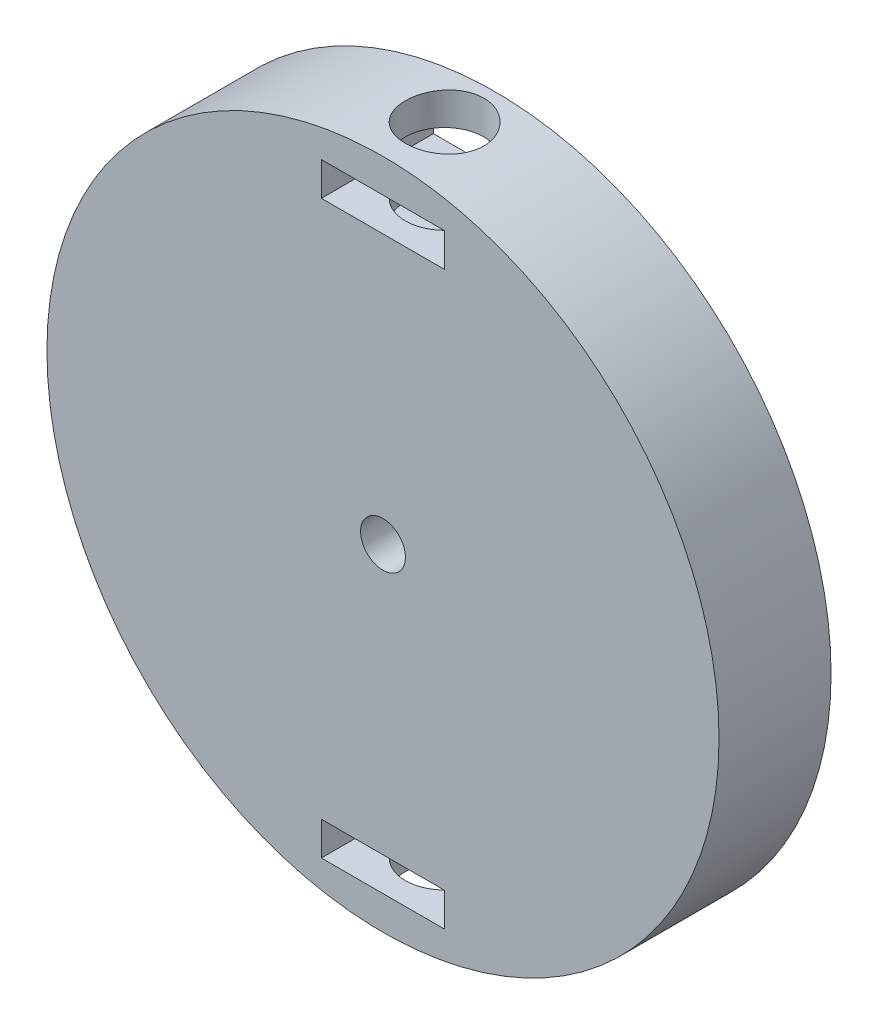
ISO-10303-21;
HEADER;
FILE_DESCRIPTION(('STEP AP214'),'2;1');
FILE_NAME('part.step','',(''),(''),'','','');
FILE_SCHEMA(('AUTOMOTIVE_DESIGN { 1 0 10303 214 1 1 1 1 }'));
ENDSEC;
DATA;
#1=APPLICATION_CONTEXT('core data for automotive mechanical design processes');
#2=APPLICATION_PROTOCOL_DEFINITION('international standard','automotive_design',2000,#1);
#3=PRODUCT_CONTEXT('',#1,'mechanical');
#4=PRODUCT('Part','Part','',(#3));
#5=PRODUCT_RELATED_PRODUCT_CATEGORY('part','',(#4));
#6=PRODUCT_DEFINITION_FORMATION('','',#4);
#7=PRODUCT_DEFINITION_CONTEXT('part definition',#1,'design');
#8=PRODUCT_DEFINITION('design','',#6,#7);
#9=PRODUCT_DEFINITION_SHAPE('','',#8);
#10=(LENGTH_UNIT() NAMED_UNIT(*) SI_UNIT(.MILLI.,.METRE.));
#11=(NAMED_UNIT(*) PLANE_ANGLE_UNIT() SI_UNIT($,.RADIAN.));
#12=(NAMED_UNIT(*) SI_UNIT($,.STERADIAN.) SOLID_ANGLE_UNIT());
#13=UNCERTAINTY_MEASURE_WITH_UNIT(LENGTH_MEASURE(1.E-05),#10,'distance_accuracy_value','');
#14=(GEOMETRIC_REPRESENTATION_CONTEXT(3) GLOBAL_UNCERTAINTY_ASSIGNED_CONTEXT((#13)) GLOBAL_UNIT_ASSIGNED_CONTEXT((#10,
#11,#12)) REPRESENTATION_CONTEXT('',''));
#15=CARTESIAN_POINT('',(0.,0.,0.));
#16=DIRECTION('',(0.,0.,1.));
#17=DIRECTION('',(1.,0.,0.));
#18=AXIS2_PLACEMENT_3D('',#15,#16,#17);
#19=CARTESIAN_POINT('',(0.,0.,10.));
#20=DIRECTION('',(0.,0.,1.));
#21=DIRECTION('',(1.,0.,0.));
#22=AXIS2_PLACEMENT_3D('',#19,#20,#21);
#23=PLANE('',#22);
#24=CARTESIAN_POINT('',(0.,0.,10.));
#25=DIRECTION('',(0.,0.,-1.));
#26=DIRECTION('',(-1.,0.,0.));
#27=AXIS2_PLACEMENT_3D('',#24,#25,#26);
#28=CIRCLE('',#27,2.);
#29=CARTESIAN_POINT('',(-2.,0.,10.));
#30=VERTEX_POINT('',#29);
#31=EDGE_CURVE('E134',#30,#30,#28,.T.);
#32=ORIENTED_EDGE('',*,*,#31,.T.);
#33=EDGE_LOOP('',(#32));
#34=FACE_BOUND('',#33,.T.);
#35=DIRECTION('',(0.,1.,0.));
#36=VECTOR('',#35,1.);
#37=CARTESIAN_POINT('',(-5.5,27.,10.));
#38=LINE('',#37,#36);
#39=CARTESIAN_POINT('',(-5.5,24.,10.));
#40=VERTEX_POINT('',#39);
#41=CARTESIAN_POINT('',(-5.5,27.,10.));
#42=VERTEX_POINT('',#41);
#43=EDGE_CURVE('E144',#40,#42,#38,.T.);
#44=ORIENTED_EDGE('',*,*,#43,.T.);
#45=DIRECTION('',(1.,0.,0.));
#46=VECTOR('',#45,1.);
#47=CARTESIAN_POINT('',(5.5,27.,10.));
#48=LINE('',#47,#46);
#49=CARTESIAN_POINT('',(5.5,27.,10.));
#50=VERTEX_POINT('',#49);
#51=EDGE_CURVE('E147',#42,#50,#48,.T.);
#52=ORIENTED_EDGE('',*,*,#51,.T.);
#53=DIRECTION('',(0.,-1.,0.));
#54=VECTOR('',#53,1.);
#55=CARTESIAN_POINT('',(5.5,27.,10.));
#56=LINE('',#55,#54);
#57=CARTESIAN_POINT('',(5.5,24.,10.));
#58=VERTEX_POINT('',#57);
#59=EDGE_CURVE('E151',#50,#58,#56,.T.);
#60=ORIENTED_EDGE('',*,*,#59,.T.);
#61=DIRECTION('',(-1.,0.,0.));
#62=VECTOR('',#61,1.);
#63=CARTESIAN_POINT('',(5.5,24.,10.));
#64=LINE('',#63,#62);
#65=EDGE_CURVE('E154',#58,#40,#64,.T.);
#66=ORIENTED_EDGE('',*,*,#65,.T.);
#67=EDGE_LOOP('',(#44,#52,#60,#66));
#68=FACE_BOUND('',#67,.T.);
#69=CARTESIAN_POINT('',(0.,0.,10.));
#70=DIRECTION('',(0.,0.,1.));
#71=DIRECTION('',(1.,0.,0.));
#72=AXIS2_PLACEMENT_3D('',#69,#70,#71);
#73=CIRCLE('',#72,30.);
#74=CARTESIAN_POINT('',(30.,0.,10.));
#75=VERTEX_POINT('',#74);
#76=EDGE_CURVE('E185',#75,#75,#73,.T.);
#77=ORIENTED_EDGE('',*,*,#76,.T.);
#78=EDGE_LOOP('',(#77));
#79=FACE_BOUND('',#78,.T.);
#80=DIRECTION('',(1.,0.,0.));
#81=VECTOR('',#80,1.);
#82=CARTESIAN_POINT('',(5.5,-27.,10.));
#83=LINE('',#82,#81);
#84=CARTESIAN_POINT('',(-5.5,-27.,10.));
#85=VERTEX_POINT('',#84);
#86=CARTESIAN_POINT('',(5.5,-27.,10.));
#87=VERTEX_POINT('',#86);
#88=EDGE_CURVE('E118',#85,#87,#83,.T.);
#89=ORIENTED_EDGE('',*,*,#88,.F.);
#90=DIRECTION('',(0.,-1.,0.));
#91=VECTOR('',#90,1.);
#92=CARTESIAN_POINT('',(-5.5,-27.,10.));
#93=LINE('',#92,#91);
#94=CARTESIAN_POINT('',(-5.5,-24.,10.));
#95=VERTEX_POINT('',#94);
#96=EDGE_CURVE('E114',#95,#85,#93,.T.);
#97=ORIENTED_EDGE('',*,*,#96,.F.);
#98=DIRECTION('',(-1.,0.,0.));
#99=VECTOR('',#98,1.);
#100=CARTESIAN_POINT('',(5.5,-24.,10.));
#101=LINE('',#100,#99);
#102=CARTESIAN_POINT('',(5.5,-24.,10.));
#103=VERTEX_POINT('',#102);
#104=EDGE_CURVE('E105',#103,#95,#101,.T.);
#105=ORIENTED_EDGE('',*,*,#104,.F.);
#106=DIRECTION('',(0.,1.,0.));
#107=VECTOR('',#106,1.);
#108=CARTESIAN_POINT('',(5.5,-27.,10.));
#109=LINE('',#108,#107);
#110=EDGE_CURVE('E113',#87,#103,#109,.T.);
#111=ORIENTED_EDGE('',*,*,#110,.F.);
#112=EDGE_LOOP('',(#89,#97,#105,#111));
#113=FACE_BOUND('',#112,.T.);
#114=ADVANCED_FACE('F37',(#34,#68,#79,#113),#23,.T.);
#115=CARTESIAN_POINT('',(0.,0.,0.));
#116=DIRECTION('',(0.,0.,1.));
#117=DIRECTION('',(1.,0.,0.));
#118=AXIS2_PLACEMENT_3D('',#115,#116,#117);
#119=PLANE('',#118);
#120=CARTESIAN_POINT('',(0.,0.,0.));
#121=DIRECTION('',(0.,0.,-1.));
#122=DIRECTION('',(-1.,0.,0.));
#123=AXIS2_PLACEMENT_3D('',#120,#121,#122);
#124=CIRCLE('',#123,2.);
#125=CARTESIAN_POINT('',(-2.,0.,0.));
#126=VERTEX_POINT('',#125);
#127=EDGE_CURVE('E127',#126,#126,#124,.T.);
#128=ORIENTED_EDGE('',*,*,#127,.F.);
#129=EDGE_LOOP('',(#128));
#130=FACE_BOUND('',#129,.T.);
#131=CARTESIAN_POINT('',(0.,0.,0.));
#132=DIRECTION('',(0.,0.,1.));
#133=DIRECTION('',(1.,0.,0.));
#134=AXIS2_PLACEMENT_3D('',#131,#132,#133);
#135=CIRCLE('',#134,30.);
#136=CARTESIAN_POINT('',(30.,0.,0.));
#137=VERTEX_POINT('',#136);
#138=EDGE_CURVE('E184',#137,#137,#135,.T.);
#139=ORIENTED_EDGE('',*,*,#138,.F.);
#140=EDGE_LOOP('',(#139));
#141=FACE_BOUND('',#140,.T.);
#142=DIRECTION('',(1.,0.,0.));
#143=VECTOR('',#142,1.);
#144=CARTESIAN_POINT('',(5.5,27.,0.));
#145=LINE('',#144,#143);
#146=CARTESIAN_POINT('',(-5.5,27.,0.));
#147=VERTEX_POINT('',#146);
#148=CARTESIAN_POINT('',(5.5,27.,0.));
#149=VERTEX_POINT('',#148);
#150=EDGE_CURVE('E160',#147,#149,#145,.T.);
#151=ORIENTED_EDGE('',*,*,#150,.F.);
#152=DIRECTION('',(0.,1.,0.));
#153=VECTOR('',#152,1.);
#154=CARTESIAN_POINT('',(-5.5,27.,0.));
#155=LINE('',#154,#153);
#156=CARTESIAN_POINT('',(-5.5,24.,0.));
#157=VERTEX_POINT('',#156);
#158=EDGE_CURVE('E158',#157,#147,#155,.T.);
#159=ORIENTED_EDGE('',*,*,#158,.F.);
#160=DIRECTION('',(-1.,0.,0.));
#161=VECTOR('',#160,1.);
#162=CARTESIAN_POINT('',(5.5,24.,0.));
#163=LINE('',#162,#161);
#164=CARTESIAN_POINT('',(5.5,24.,0.));
#165=VERTEX_POINT('',#164);
#166=EDGE_CURVE('E148',#165,#157,#163,.T.);
#167=ORIENTED_EDGE('',*,*,#166,.F.);
#168=DIRECTION('',(0.,-1.,0.));
#169=VECTOR('',#168,1.);
#170=CARTESIAN_POINT('',(5.5,27.,0.));
#171=LINE('',#170,#169);
#172=EDGE_CURVE('E163',#149,#165,#171,.T.);
#173=ORIENTED_EDGE('',*,*,#172,.F.);
#174=EDGE_LOOP('',(#151,#159,#167,#173));
#175=FACE_BOUND('',#174,.T.);
#176=DIRECTION('',(0.,-1.,0.));
#177=VECTOR('',#176,1.);
#178=CARTESIAN_POINT('',(-5.5,-27.,0.));
#179=LINE('',#178,#177);
#180=CARTESIAN_POINT('',(-5.5,-24.,0.));
#181=VERTEX_POINT('',#180);
#182=CARTESIAN_POINT('',(-5.5,-27.,0.));
#183=VERTEX_POINT('',#182);
#184=EDGE_CURVE('E63',#181,#183,#179,.T.);
#185=ORIENTED_EDGE('',*,*,#184,.T.);
#186=DIRECTION('',(1.,0.,0.));
#187=VECTOR('',#186,1.);
#188=CARTESIAN_POINT('',(5.5,-27.,0.));
#189=LINE('',#188,#187);
#190=CARTESIAN_POINT('',(5.5,-27.,0.));
#191=VERTEX_POINT('',#190);
#192=EDGE_CURVE('E121',#183,#191,#189,.T.);
#193=ORIENTED_EDGE('',*,*,#192,.T.);
#194=DIRECTION('',(0.,1.,0.));
#195=VECTOR('',#194,1.);
#196=CARTESIAN_POINT('',(5.5,-27.,0.));
#197=LINE('',#196,#195);
#198=CARTESIAN_POINT('',(5.5,-24.,0.));
#199=VERTEX_POINT('',#198);
#200=EDGE_CURVE('E124',#191,#199,#197,.T.);
#201=ORIENTED_EDGE('',*,*,#200,.T.);
#202=DIRECTION('',(-1.,0.,0.));
#203=VECTOR('',#202,1.);
#204=CARTESIAN_POINT('',(5.5,-24.,0.));
#205=LINE('',#204,#203);
#206=EDGE_CURVE('E133',#199,#181,#205,.T.);
#207=ORIENTED_EDGE('',*,*,#206,.T.);
#208=EDGE_LOOP('',(#185,#193,#201,#207));
#209=FACE_BOUND('',#208,.T.);
#210=ADVANCED_FACE('F205',(#130,#141,#175,#209),#119,.F.);
#211=CARTESIAN_POINT('',(0.,-22.,4.5));
#212=DIRECTION('',(0.,-1.,0.));
#213=DIRECTION('',(0.,0.,-1.));
#214=AXIS2_PLACEMENT_3D('',#211,#212,#213);
#215=CYLINDRICAL_SURFACE('',#214,3.5);
#216=CARTESIAN_POINT('',(0.,-30.,1.));
#217=CARTESIAN_POINT('',(-0.195882541712837,-29.9999974197862,1.00000838323899));
#218=CARTESIAN_POINT('',(-0.391890034127185,-29.9980611952877,1.01649969012434));
#219=CARTESIAN_POINT('',(-0.778457998872423,-29.9905234329931,1.08203049478134));
#220=CARTESIAN_POINT('',(-0.969012445773828,-29.9849179925631,1.13110464896171));
#221=CARTESIAN_POINT('',(-1.3390214360296,-29.9706737366924,1.26034183044303));
#222=CARTESIAN_POINT('',(-1.51848309024978,-29.9620368887122,1.34048469687843));
#223=CARTESIAN_POINT('',(-1.86137292503613,-29.9426922509929,1.5295419496513));
#224=CARTESIAN_POINT('',(-2.0248040044965,-29.9319848367299,1.63845112082169));
#225=CARTESIAN_POINT('',(-2.33181789683613,-29.9096381893093,1.88251189287747));
#226=CARTESIAN_POINT('',(-2.47531229198819,-29.8979951454007,2.0177743800348));
#227=CARTESIAN_POINT('',(-2.73761855547876,-29.8751204838019,2.31046449810396));
#228=CARTESIAN_POINT('',(-2.85642920898221,-29.8638888863838,2.46789321930975));
#229=CARTESIAN_POINT('',(-3.06631951904974,-29.8430709076409,2.80101473973443));
#230=CARTESIAN_POINT('',(-3.15731726004517,-29.8334894217807,2.97675948384393));
#231=CARTESIAN_POINT('',(-3.3084755727138,-29.8171059071129,3.34116612418663));
#232=CARTESIAN_POINT('',(-3.36863716674691,-29.8103037861583,3.52982759193599));
#233=CARTESIAN_POINT('',(-3.45614884157181,-29.800285003044,3.91379946011149));
#234=CARTESIAN_POINT('',(-3.48364740541473,-29.7970521202345,4.10907558900021));
#235=CARTESIAN_POINT('',(-3.5055117293051,-29.7944880064516,4.50149586846462));
#236=CARTESIAN_POINT('',(-3.49987865604091,-29.7951566380913,4.69863995301856));
#237=CARTESIAN_POINT('',(-3.45576166590514,-29.8003051678475,5.08816919482382));
#238=CARTESIAN_POINT('',(-3.41744079079549,-29.8047661499263,5.28057310314202));
#239=CARTESIAN_POINT('',(-3.30929012266411,-29.8169672304119,5.65620030073932));
#240=CARTESIAN_POINT('',(-3.23945976679002,-29.8247073873944,5.83942342595757));
#241=CARTESIAN_POINT('',(-3.07009543603852,-29.8426162747908,6.19199758922861));
#242=CARTESIAN_POINT('',(-2.97049008035152,-29.8527908294508,6.3613140305382));
#243=CARTESIAN_POINT('',(-2.7444543213942,-29.8744174638639,6.68088963642528));
#244=CARTESIAN_POINT('',(-2.6180228488228,-29.8858695945331,6.83114804095927));
#245=CARTESIAN_POINT('',(-2.3410176768871,-29.9088451987352,7.10928902741125));
#246=CARTESIAN_POINT('',(-2.19030334511706,-29.9203686870805,7.23703159174813));
#247=CARTESIAN_POINT('',(-1.86949636059002,-29.9421239637101,7.46542633002069));
#248=CARTESIAN_POINT('',(-1.69940367238697,-29.9523557496316,7.56607845440254));
#249=CARTESIAN_POINT('',(-1.34456422490668,-29.9703799975135,7.73743322100222));
#250=CARTESIAN_POINT('',(-1.15981348351237,-29.9781717937442,7.80812769139421));
#251=CARTESIAN_POINT('',(-0.780952791788824,-29.9904318774451,7.9174523032941));
#252=CARTESIAN_POINT('',(-0.58684322320208,-29.9949003003524,7.95608375146997));
#253=CARTESIAN_POINT('',(-0.195986265857937,-29.9999926437417,8.00000561681946));
#254=CARTESIAN_POINT('',(0.000739156689146664,-30.0006388181721,8.00548903304314));
#255=CARTESIAN_POINT('',(0.392306125202524,-29.9980737964039,7.98346764205692));
#256=CARTESIAN_POINT('',(0.587147705945408,-29.9948626715503,7.95596344499023));
#257=CARTESIAN_POINT('',(0.968851120255682,-29.9849578334644,7.86890783214617));
#258=CARTESIAN_POINT('',(1.15573408676981,-29.9782740580688,7.80944784903421));
#259=CARTESIAN_POINT('',(1.51687497501908,-29.9621727271582,7.66026318029485));
#260=CARTESIAN_POINT('',(1.69113251884084,-29.9527550898535,7.57053758918942));
#261=CARTESIAN_POINT('',(2.02294180745183,-29.9321816873819,7.36289756077817));
#262=CARTESIAN_POINT('',(2.1804145046636,-29.9210182603436,7.24485757714129));
#263=CARTESIAN_POINT('',(2.47338125070933,-29.8982276818298,6.98411795038264));
#264=CARTESIAN_POINT('',(2.6088745428213,-29.8866005144056,6.8414174585812));
#265=CARTESIAN_POINT('',(2.85471586846419,-29.8641248420561,6.53456023007898));
#266=CARTESIAN_POINT('',(2.96493641359511,-29.8532804662637,6.37030100895794));
#267=CARTESIAN_POINT('',(3.15622430568863,-29.8336644336942,6.02548924498518));
#268=CARTESIAN_POINT('',(3.237292172474,-29.8248927399598,5.84493699272708));
#269=CARTESIAN_POINT('',(3.36776456035817,-29.8104426362889,5.47308495997447));
#270=CARTESIAN_POINT('',(3.41724237784382,-29.8047570704364,5.28181118693792));
#271=CARTESIAN_POINT('',(3.48336688591535,-29.7971018927308,4.89360014072396));
#272=CARTESIAN_POINT('',(3.50001489214338,-29.7951321319682,4.69666309482095));
#273=CARTESIAN_POINT('',(3.49998517683329,-29.7951355219916,4.30398366170038));
#274=CARTESIAN_POINT('',(3.48350772592628,-29.7970849778918,4.10824122871468));
#275=CARTESIAN_POINT('',(3.41811743154478,-29.8046563578148,3.72232720605022));
#276=CARTESIAN_POINT('',(3.3692045714536,-29.8102782837189,3.53215561922547));
#277=CARTESIAN_POINT('',(3.24039197917875,-29.8245541001705,3.1627991665996));
#278=CARTESIAN_POINT('',(3.16050057470854,-29.833207175818,2.98361136309548));
#279=CARTESIAN_POINT('',(2.97201859768612,-29.8525717724136,2.64115403761436));
#280=CARTESIAN_POINT('',(2.8634278498392,-29.8632833059347,2.47788461287467));
#281=CARTESIAN_POINT('',(2.61988285152547,-29.8856355442631,2.17087360472587));
#282=CARTESIAN_POINT('',(2.48477922923815,-29.8972812816633,2.02725087459627));
#283=CARTESIAN_POINT('',(2.19235144037643,-29.9201446799927,1.76463538824719));
#284=CARTESIAN_POINT('',(2.0350220147138,-29.9313622388058,1.64564847785334));
#285=CARTESIAN_POINT('',(1.70201512751985,-29.9521459547223,1.43535212054322));
#286=CARTESIAN_POINT('',(1.52627828181956,-29.9617064852924,1.34413620808802));
#287=CARTESIAN_POINT('',(1.1619731747424,-29.9780407982637,1.19263671524037));
#288=CARTESIAN_POINT('',(0.973419305258653,-29.9848176480552,1.132319069253));
#289=CARTESIAN_POINT('',(0.653213220983181,-29.9931624988777,1.05898321781911));
#290=CARTESIAN_POINT('',(0.52359078100402,-29.9957142631826,1.03689573244819));
#291=CARTESIAN_POINT('',(0.262664284506039,-29.9991338737417,1.00740135756755));
#292=CARTESIAN_POINT('',(0.131360238292012,-30.0000017303099,0.999994378139766));
#293=CARTESIAN_POINT('',(0.,-30.,1.));
#294=B_SPLINE_CURVE_WITH_KNOTS('',3,(#216,#217,#218,#219,#220,#221,#222,#223,#224,#225,#226,
#227,#228,#229,#230,#231,#232,#233,#234,#235,#236,#237,#238,#239,#240,#241,#242,#243,#244,#245,
#246,#247,#248,#249,#250,#251,#252,#253,#254,#255,#256,#257,#258,#259,#260,#261,#262,#263,#264,
#265,#266,#267,#268,#269,#270,#271,#272,#273,#274,#275,#276,#277,#278,#279,#280,#281,#282,#283,
#284,#285,#286,#287,#288,#289,#290,#291,#292,#293),.UNSPECIFIED.,.T.,.F.,(4,2,2,2,2,2,2,2,2,2,2,
2,2,2,2,2,2,2,2,2,2,2,2,2,2,2,2,2,2,2,2,2,2,2,2,2,2,2,4),(0.,0.587167858566608,1.17496125479887,
1.76237386149104,2.34968004663499,2.93951298413913,3.52937494398853,4.12095780725906,
4.71252105557144,5.3013846938575,5.89022759618529,6.47615049989602,7.0620838703341,
7.64943334403288,8.23680623414554,8.82771194449379,9.41861873571896,10.0096866104489,
10.6007303961402,11.1883295847389,11.775917905194,12.361833885341,12.9477673963138,
13.5363485964417,14.1249500563466,14.7164584139973,15.3079562239116,15.8980765831533,
16.4881732930661,17.0747131123726,17.6612532321643,18.2476357862727,18.8340219220706,
19.4238118187211,20.0137415064345,20.6056366768657,21.1968778658292,21.5906392575942,
21.9843982375639),.UNSPECIFIED.);
#295=CARTESIAN_POINT('',(0.,-30.,1.));
#296=VERTEX_POINT('',#295);
#297=EDGE_CURVE('E47',#296,#296,#294,.T.);
#298=ORIENTED_EDGE('',*,*,#297,.F.);
#299=EDGE_LOOP('',(#298));
#300=FACE_BOUND('',#299,.T.);
#301=CARTESIAN_POINT('',(0.,-27.,4.5));
#302=DIRECTION('',(0.,1.,0.));
#303=DIRECTION('',(0.,0.,1.));
#304=AXIS2_PLACEMENT_3D('',#301,#302,#303);
#305=CIRCLE('',#304,3.5);
#306=CARTESIAN_POINT('',(0.,-27.,8.));
#307=VERTEX_POINT('',#306);
#308=EDGE_CURVE('E42',#307,#307,#305,.F.);
#309=ORIENTED_EDGE('',*,*,#308,.F.);
#310=EDGE_LOOP('',(#309));
#311=FACE_BOUND('',#310,.T.);
#312=ADVANCED_FACE('F200',(#300,#311),#215,.F.);
#313=CARTESIAN_POINT('',(0.,0.,10.));
#314=DIRECTION('',(0.,0.,-1.));
#315=DIRECTION('',(-1.,0.,0.));
#316=AXIS2_PLACEMENT_3D('',#313,#314,#315);
#317=CYLINDRICAL_SURFACE('',#316,30.);
#318=ORIENTED_EDGE('',*,*,#297,.T.);
#319=EDGE_LOOP('',(#318));
#320=FACE_BOUND('',#319,.T.);
#321=ORIENTED_EDGE('',*,*,#76,.F.);
#322=EDGE_LOOP('',(#321));
#323=FACE_BOUND('',#322,.T.);
#324=ORIENTED_EDGE('',*,*,#138,.T.);
#325=EDGE_LOOP('',(#324));
#326=FACE_BOUND('',#325,.T.);
#327=CARTESIAN_POINT('',(0.,30.,8.));
#328=CARTESIAN_POINT('',(0.195882541712838,29.9999974197862,7.99999161676101));
#329=CARTESIAN_POINT('',(0.391890034127185,29.9980611952877,7.98350030987566));
#330=CARTESIAN_POINT('',(0.778457998872424,29.9905234329931,7.91796950521866));
#331=CARTESIAN_POINT('',(0.969012445773828,29.9849179925631,7.86889535103829));
#332=CARTESIAN_POINT('',(1.3390214360296,29.9706737366924,7.73965816955697));
#333=CARTESIAN_POINT('',(1.51848309024978,29.9620368887122,7.65951530312157));
#334=CARTESIAN_POINT('',(1.86137292503614,29.9426922509929,7.4704580503487));
#335=CARTESIAN_POINT('',(2.0248040044965,29.9319848367299,7.36154887917831));
#336=CARTESIAN_POINT('',(2.33181789683613,29.9096381893093,7.11748810712253));
#337=CARTESIAN_POINT('',(2.47531229198819,29.8979951454007,6.9822256199652));
#338=CARTESIAN_POINT('',(2.73761855547876,29.8751204838019,6.68953550189604));
#339=CARTESIAN_POINT('',(2.85642920898221,29.8638888863838,6.53210678069025));
#340=CARTESIAN_POINT('',(3.06631951904974,29.8430709076409,6.19898526026557));
#341=CARTESIAN_POINT('',(3.15731726004517,29.8334894217807,6.02324051615607));
#342=CARTESIAN_POINT('',(3.3084755727138,29.8171059071129,5.65883387581337));
#343=CARTESIAN_POINT('',(3.36863716674691,29.8103037861583,5.47017240806401));
#344=CARTESIAN_POINT('',(3.45614884157181,29.800285003044,5.08620053988851));
#345=CARTESIAN_POINT('',(3.48364740541474,29.7970521202345,4.89092441099979));
#346=CARTESIAN_POINT('',(3.5055117293051,29.7944880064516,4.49850413153539));
#347=CARTESIAN_POINT('',(3.49987865604091,29.7951566380913,4.30136004698144));
#348=CARTESIAN_POINT('',(3.45576166590514,29.8003051678475,3.91183080517618));
#349=CARTESIAN_POINT('',(3.41744079079549,29.8047661499263,3.71942689685798));
#350=CARTESIAN_POINT('',(3.30929012266411,29.8169672304119,3.34379969926068));
#351=CARTESIAN_POINT('',(3.23945976679002,29.8247073873944,3.16057657404243));
#352=CARTESIAN_POINT('',(3.07009543603852,29.8426162747908,2.80800241077139));
#353=CARTESIAN_POINT('',(2.97049008035152,29.8527908294508,2.6386859694618));
#354=CARTESIAN_POINT('',(2.7444543213942,29.8744174638639,2.31911036357472));
#355=CARTESIAN_POINT('',(2.6180228488228,29.8858695945331,2.16885195904073));
#356=CARTESIAN_POINT('',(2.3410176768871,29.9088451987352,1.89071097258875));
#357=CARTESIAN_POINT('',(2.19030334511706,29.9203686870805,1.76296840825187));
#358=CARTESIAN_POINT('',(1.86949636059002,29.9421239637101,1.53457366997932));
#359=CARTESIAN_POINT('',(1.69940367238697,29.9523557496316,1.43392154559746));
#360=CARTESIAN_POINT('',(1.34456422490668,29.9703799975135,1.26256677899778));
#361=CARTESIAN_POINT('',(1.15981348351237,29.9781717937442,1.19187230860579));
#362=CARTESIAN_POINT('',(0.780952791788823,29.9904318774451,1.0825476967059));
#363=CARTESIAN_POINT('',(0.586843223202079,29.9949003003524,1.04391624853003));
#364=CARTESIAN_POINT('',(0.195986265857937,29.9999926437417,0.999994383180539));
#365=CARTESIAN_POINT('',(-0.000739156689147233,30.0006388181721,0.994510966956864));
#366=CARTESIAN_POINT('',(-0.392306125202525,29.9980737964039,1.01653235794308));
#367=CARTESIAN_POINT('',(-0.587147705945409,29.9948626715503,1.04403655500977));
#368=CARTESIAN_POINT('',(-0.968851120255682,29.9849578334644,1.13109216785383));
#369=CARTESIAN_POINT('',(-1.15573408676981,29.9782740580688,1.19055215096579));
#370=CARTESIAN_POINT('',(-1.51687497501908,29.9621727271582,1.33973681970515));
#371=CARTESIAN_POINT('',(-1.69113251884084,29.9527550898535,1.42946241081058));
#372=CARTESIAN_POINT('',(-2.02294180745183,29.9321816873819,1.63710243922183));
#373=CARTESIAN_POINT('',(-2.1804145046636,29.9210182603436,1.75514242285871));
#374=CARTESIAN_POINT('',(-2.47338125070933,29.8982276818298,2.01588204961736));
#375=CARTESIAN_POINT('',(-2.6088745428213,29.8866005144056,2.1585825414188));
#376=CARTESIAN_POINT('',(-2.85471586846419,29.8641248420561,2.46543976992102));
#377=CARTESIAN_POINT('',(-2.96493641359511,29.8532804662637,2.62969899104206));
#378=CARTESIAN_POINT('',(-3.15622430568863,29.8336644336942,2.97451075501482));
#379=CARTESIAN_POINT('',(-3.237292172474,29.8248927399598,3.15506300727292));
#380=CARTESIAN_POINT('',(-3.36776456035817,29.8104426362889,3.52691504002553));
#381=CARTESIAN_POINT('',(-3.41724237784382,29.8047570704364,3.71818881306208));
#382=CARTESIAN_POINT('',(-3.48336688591535,29.7971018927308,4.10639985927604));
#383=CARTESIAN_POINT('',(-3.50001489214338,29.7951321319682,4.30333690517905));
#384=CARTESIAN_POINT('',(-3.49998517683329,29.7951355219916,4.69601633829962));
#385=CARTESIAN_POINT('',(-3.48350772592628,29.7970849778918,4.89175877128532));
#386=CARTESIAN_POINT('',(-3.41811743154478,29.8046563578148,5.27767279394978));
#387=CARTESIAN_POINT('',(-3.3692045714536,29.8102782837189,5.46784438077453));
#388=CARTESIAN_POINT('',(-3.24039197917875,29.8245541001705,5.83720083340041));
#389=CARTESIAN_POINT('',(-3.16050057470854,29.833207175818,6.01638863690452));
#390=CARTESIAN_POINT('',(-2.97201859768612,29.8525717724136,6.35884596238564));
#391=CARTESIAN_POINT('',(-2.8634278498392,29.8632833059347,6.52211538712534));
#392=CARTESIAN_POINT('',(-2.61988285152547,29.8856355442631,6.82912639527413));
#393=CARTESIAN_POINT('',(-2.48477922923815,29.8972812816633,6.97274912540374));
#394=CARTESIAN_POINT('',(-2.19235144037643,29.9201446799927,7.23536461175282));
#395=CARTESIAN_POINT('',(-2.0350220147138,29.9313622388058,7.35435152214666));
#396=CARTESIAN_POINT('',(-1.70201512751985,29.9521459547223,7.56464787945678));
#397=CARTESIAN_POINT('',(-1.52627828181956,29.9617064852924,7.65586379191198));
#398=CARTESIAN_POINT('',(-1.1619731747424,29.9780407982637,7.80736328475964));
#399=CARTESIAN_POINT('',(-0.973419305258652,29.9848176480552,7.867680930747));
#400=CARTESIAN_POINT('',(-0.653213220983182,29.9931624988777,7.94101678218089));
#401=CARTESIAN_POINT('',(-0.523590781004022,29.9957142631826,7.96310426755181));
#402=CARTESIAN_POINT('',(-0.262664284506041,29.9991338737417,7.99259864243245));
#403=CARTESIAN_POINT('',(-0.131360238292013,30.0000017303099,8.00000562186023));
#404=CARTESIAN_POINT('',(0.,30.,8.));
#405=B_SPLINE_CURVE_WITH_KNOTS('',3,(#327,#328,#329,#330,#331,#332,#333,#334,#335,#336,#337,
#338,#339,#340,#341,#342,#343,#344,#345,#346,#347,#348,#349,#350,#351,#352,#353,#354,#355,#356,
#357,#358,#359,#360,#361,#362,#363,#364,#365,#366,#367,#368,#369,#370,#371,#372,#373,#374,#375,
#376,#377,#378,#379,#380,#381,#382,#383,#384,#385,#386,#387,#388,#389,#390,#391,#392,#393,#394,
#395,#396,#397,#398,#399,#400,#401,#402,#403,#404),.UNSPECIFIED.,.T.,.F.,(4,2,2,2,2,2,2,2,2,2,2,
2,2,2,2,2,2,2,2,2,2,2,2,2,2,2,2,2,2,2,2,2,2,2,2,2,2,2,4),(0.,0.587167858566609,1.17496125479887,
1.76237386149104,2.34968004663499,2.93951298413913,3.52937494398853,4.12095780725906,
4.71252105557144,5.3013846938575,5.89022759618529,6.47615049989602,7.0620838703341,
7.64943334403288,8.23680623414554,8.82771194449379,9.41861873571897,10.0096866104489,
10.6007303961402,11.1883295847389,11.775917905194,12.361833885341,12.9477673963138,
13.5363485964417,14.1249500563466,14.7164584139973,15.3079562239116,15.8980765831533,
16.4881732930661,17.0747131123726,17.6612532321643,18.2476357862727,18.8340219220706,
19.4238118187211,20.0137415064345,20.6056366768657,21.1968778658292,21.5906392575942,
21.9843982375639),.UNSPECIFIED.);
#406=CARTESIAN_POINT('',(0.,30.,8.));
#407=VERTEX_POINT('',#406);
#408=EDGE_CURVE('E11',#407,#407,#405,.T.);
#409=ORIENTED_EDGE('',*,*,#408,.F.);
#410=EDGE_LOOP('',(#409));
#411=FACE_BOUND('',#410,.T.);
#412=ADVANCED_FACE('F39',(#320,#323,#326,#411),#317,.T.);
#413=CARTESIAN_POINT('',(0.,22.,4.5));
#414=DIRECTION('',(0.,1.,0.));
#415=DIRECTION('',(0.,0.,1.));
#416=AXIS2_PLACEMENT_3D('',#413,#414,#415);
#417=CYLINDRICAL_SURFACE('',#416,3.5);
#418=CARTESIAN_POINT('',(0.,27.,4.5));
#419=DIRECTION('',(0.,1.,0.));
#420=DIRECTION('',(0.,0.,1.));
#421=AXIS2_PLACEMENT_3D('',#418,#419,#420);
#422=CIRCLE('',#421,3.5);
#423=CARTESIAN_POINT('',(0.,27.,8.));
#424=VERTEX_POINT('',#423);
#425=EDGE_CURVE('E170',#424,#424,#422,.T.);
#426=ORIENTED_EDGE('',*,*,#425,.F.);
#427=EDGE_LOOP('',(#426));
#428=FACE_BOUND('',#427,.T.);
#429=ORIENTED_EDGE('',*,*,#408,.T.);
#430=EDGE_LOOP('',(#429));
#431=FACE_BOUND('',#430,.T.);
#432=ADVANCED_FACE('F247',(#428,#431),#417,.F.);
#433=CARTESIAN_POINT('',(-5.5,27.,10.));
#434=DIRECTION('',(-1.,0.,0.));
#435=DIRECTION('',(0.,-1.,0.));
#436=AXIS2_PLACEMENT_3D('',#433,#434,#435);
#437=PLANE('',#436);
#438=ORIENTED_EDGE('',*,*,#158,.T.);
#439=DIRECTION('',(0.,0.,-1.));
#440=VECTOR('',#439,1.);
#441=CARTESIAN_POINT('',(-5.5,27.,10.));
#442=LINE('',#441,#440);
#443=EDGE_CURVE('E157',#42,#147,#442,.T.);
#444=ORIENTED_EDGE('',*,*,#443,.F.);
#445=ORIENTED_EDGE('',*,*,#43,.F.);
#446=DIRECTION('',(0.,0.,-1.));
#447=VECTOR('',#446,1.);
#448=CARTESIAN_POINT('',(-5.5,24.,10.));
#449=LINE('',#448,#447);
#450=EDGE_CURVE('E168',#40,#157,#449,.T.);
#451=ORIENTED_EDGE('',*,*,#450,.T.);
#452=EDGE_LOOP('',(#438,#444,#445,#451));
#453=FACE_BOUND('',#452,.T.);
#454=ADVANCED_FACE('F250',(#453),#437,.F.);
#455=CARTESIAN_POINT('',(5.5,24.,10.));
#456=DIRECTION('',(0.,-1.,0.));
#457=DIRECTION('',(0.,0.,-1.));
#458=AXIS2_PLACEMENT_3D('',#455,#456,#457);
#459=PLANE('',#458);
#460=CARTESIAN_POINT('',(0.,24.,4.5));
#461=DIRECTION('',(0.,-1.,0.));
#462=DIRECTION('',(0.,0.,-1.));
#463=AXIS2_PLACEMENT_3D('',#460,#461,#462);
#464=CIRCLE('',#463,3.5);
#465=CARTESIAN_POINT('',(0.,24.,1.));
#466=VERTEX_POINT('',#465);
#467=EDGE_CURVE('E181',#466,#466,#464,.T.);
#468=ORIENTED_EDGE('',*,*,#467,.T.);
#469=EDGE_LOOP('',(#468));
#470=FACE_BOUND('',#469,.T.);
#471=ORIENTED_EDGE('',*,*,#166,.T.);
#472=ORIENTED_EDGE('',*,*,#450,.F.);
#473=ORIENTED_EDGE('',*,*,#65,.F.);
#474=DIRECTION('',(0.,0.,-1.));
#475=VECTOR('',#474,1.);
#476=CARTESIAN_POINT('',(5.5,24.,10.));
#477=LINE('',#476,#475);
#478=EDGE_CURVE('E171',#58,#165,#477,.T.);
#479=ORIENTED_EDGE('',*,*,#478,.T.);
#480=EDGE_LOOP('',(#471,#472,#473,#479));
#481=FACE_BOUND('',#480,.T.);
#482=ADVANCED_FACE('F276',(#470,#481),#459,.F.);
#483=CARTESIAN_POINT('',(5.5,27.,10.));
#484=DIRECTION('',(1.,0.,0.));
#485=DIRECTION('',(0.,1.,0.));
#486=AXIS2_PLACEMENT_3D('',#483,#484,#485);
#487=PLANE('',#486);
#488=ORIENTED_EDGE('',*,*,#172,.T.);
#489=ORIENTED_EDGE('',*,*,#478,.F.);
#490=ORIENTED_EDGE('',*,*,#59,.F.);
#491=DIRECTION('',(0.,0.,-1.));
#492=VECTOR('',#491,1.);
#493=CARTESIAN_POINT('',(5.5,27.,10.));
#494=LINE('',#493,#492);
#495=EDGE_CURVE('E173',#50,#149,#494,.T.);
#496=ORIENTED_EDGE('',*,*,#495,.T.);
#497=EDGE_LOOP('',(#488,#489,#490,#496));
#498=FACE_BOUND('',#497,.T.);
#499=ADVANCED_FACE('F284',(#498),#487,.F.);
#500=CARTESIAN_POINT('',(5.5,27.,10.));
#501=DIRECTION('',(0.,1.,0.));
#502=DIRECTION('',(0.,0.,1.));
#503=AXIS2_PLACEMENT_3D('',#500,#501,#502);
#504=PLANE('',#503);
#505=ORIENTED_EDGE('',*,*,#425,.T.);
#506=EDGE_LOOP('',(#505));
#507=FACE_BOUND('',#506,.T.);
#508=ORIENTED_EDGE('',*,*,#150,.T.);
#509=ORIENTED_EDGE('',*,*,#495,.F.);
#510=ORIENTED_EDGE('',*,*,#51,.F.);
#511=ORIENTED_EDGE('',*,*,#443,.T.);
#512=EDGE_LOOP('',(#508,#509,#510,#511));
#513=FACE_BOUND('',#512,.T.);
#514=ADVANCED_FACE('F244',(#507,#513),#504,.F.);
#515=CARTESIAN_POINT('',(0.,22.,4.5));
#516=DIRECTION('',(0.,1.,0.));
#517=DIRECTION('',(0.,0.,-1.));
#518=AXIS2_PLACEMENT_3D('',#515,#516,#517);
#519=PLANE('',#518);
#520=CARTESIAN_POINT('',(0.,22.,4.5));
#521=DIRECTION('',(0.,-1.,0.));
#522=DIRECTION('',(0.,0.,-1.));
#523=AXIS2_PLACEMENT_3D('',#520,#521,#522);
#524=CIRCLE('',#523,3.5);
#525=CARTESIAN_POINT('',(0.,22.,1.));
#526=VERTEX_POINT('',#525);
#527=EDGE_CURVE('E177',#526,#526,#524,.T.);
#528=ORIENTED_EDGE('',*,*,#527,.F.);
#529=EDGE_LOOP('',(#528));
#530=FACE_BOUND('',#529,.T.);
#531=ADVANCED_FACE('F299',(#530),#519,.T.);
#532=ORIENTED_EDGE('',*,*,#467,.F.);
#533=EDGE_LOOP('',(#532));
#534=FACE_BOUND('',#533,.T.);
#535=ORIENTED_EDGE('',*,*,#527,.T.);
#536=EDGE_LOOP('',(#535));
#537=FACE_BOUND('',#536,.T.);
#538=ADVANCED_FACE('F232',(#534,#537),#417,.F.);
#539=CARTESIAN_POINT('',(5.5,-27.,10.));
#540=DIRECTION('',(0.,1.,0.));
#541=DIRECTION('',(0.,0.,1.));
#542=AXIS2_PLACEMENT_3D('',#539,#540,#541);
#543=PLANE('',#542);
#544=ORIENTED_EDGE('',*,*,#192,.F.);
#545=DIRECTION('',(0.,0.,-1.));
#546=VECTOR('',#545,1.);
#547=CARTESIAN_POINT('',(-5.5,-27.,10.));
#548=LINE('',#547,#546);
#549=EDGE_CURVE('E138',#85,#183,#548,.T.);
#550=ORIENTED_EDGE('',*,*,#549,.F.);
#551=ORIENTED_EDGE('',*,*,#88,.T.);
#552=DIRECTION('',(0.,0.,-1.));
#553=VECTOR('',#552,1.);
#554=CARTESIAN_POINT('',(5.5,-27.,10.));
#555=LINE('',#554,#553);
#556=EDGE_CURVE('E141',#87,#191,#555,.T.);
#557=ORIENTED_EDGE('',*,*,#556,.T.);
#558=EDGE_LOOP('',(#544,#550,#551,#557));
#559=FACE_BOUND('',#558,.T.);
#560=ORIENTED_EDGE('',*,*,#308,.T.);
#561=EDGE_LOOP('',(#560));
#562=FACE_BOUND('',#561,.T.);
#563=ADVANCED_FACE('F229',(#559,#562),#543,.T.);
#564=CARTESIAN_POINT('',(5.5,-24.,10.));
#565=DIRECTION('',(0.,-1.,0.));
#566=DIRECTION('',(0.,0.,-1.));
#567=AXIS2_PLACEMENT_3D('',#564,#565,#566);
#568=PLANE('',#567);
#569=ORIENTED_EDGE('',*,*,#206,.F.);
#570=DIRECTION('',(0.,0.,-1.));
#571=VECTOR('',#570,1.);
#572=CARTESIAN_POINT('',(5.5,-24.,10.));
#573=LINE('',#572,#571);
#574=EDGE_CURVE('E55',#103,#199,#573,.T.);
#575=ORIENTED_EDGE('',*,*,#574,.F.);
#576=ORIENTED_EDGE('',*,*,#104,.T.);
#577=DIRECTION('',(0.,0.,-1.));
#578=VECTOR('',#577,1.);
#579=CARTESIAN_POINT('',(-5.5,-24.,10.));
#580=LINE('',#579,#578);
#581=EDGE_CURVE('E108',#95,#181,#580,.T.);
#582=ORIENTED_EDGE('',*,*,#581,.T.);
#583=EDGE_LOOP('',(#569,#575,#576,#582));
#584=FACE_BOUND('',#583,.T.);
#585=CARTESIAN_POINT('',(0.,-24.,4.5));
#586=DIRECTION('',(0.,-1.,0.));
#587=DIRECTION('',(0.,0.,-1.));
#588=AXIS2_PLACEMENT_3D('',#585,#586,#587);
#589=CIRCLE('',#588,3.5);
#590=CARTESIAN_POINT('',(0.,-24.,1.));
#591=VERTEX_POINT('',#590);
#592=EDGE_CURVE('E140',#591,#591,#589,.F.);
#593=ORIENTED_EDGE('',*,*,#592,.T.);
#594=EDGE_LOOP('',(#593));
#595=FACE_BOUND('',#594,.T.);
#596=ADVANCED_FACE('F106',(#584,#595),#568,.T.);
#597=CARTESIAN_POINT('',(-5.5,-27.,10.));
#598=DIRECTION('',(1.,0.,0.));
#599=DIRECTION('',(0.,1.,0.));
#600=AXIS2_PLACEMENT_3D('',#597,#598,#599);
#601=PLANE('',#600);
#602=ORIENTED_EDGE('',*,*,#184,.F.);
#603=ORIENTED_EDGE('',*,*,#581,.F.);
#604=ORIENTED_EDGE('',*,*,#96,.T.);
#605=ORIENTED_EDGE('',*,*,#549,.T.);
#606=EDGE_LOOP('',(#602,#603,#604,#605));
#607=FACE_BOUND('',#606,.T.);
#608=ADVANCED_FACE('F116',(#607),#601,.T.);
#609=CARTESIAN_POINT('',(5.5,-27.,10.));
#610=DIRECTION('',(-1.,0.,0.));
#611=DIRECTION('',(0.,-1.,0.));
#612=AXIS2_PLACEMENT_3D('',#609,#610,#611);
#613=PLANE('',#612);
#614=ORIENTED_EDGE('',*,*,#200,.F.);
#615=ORIENTED_EDGE('',*,*,#556,.F.);
#616=ORIENTED_EDGE('',*,*,#110,.T.);
#617=ORIENTED_EDGE('',*,*,#574,.T.);
#618=EDGE_LOOP('',(#614,#615,#616,#617));
#619=FACE_BOUND('',#618,.T.);
#620=ADVANCED_FACE('F227',(#619),#613,.T.);
#621=CARTESIAN_POINT('',(0.,-22.,4.5));
#622=DIRECTION('',(0.,-1.,0.));
#623=DIRECTION('',(0.,0.,-1.));
#624=AXIS2_PLACEMENT_3D('',#621,#622,#623);
#625=PLANE('',#624);
#626=CARTESIAN_POINT('',(0.,-22.,4.5));
#627=DIRECTION('',(0.,-1.,0.));
#628=DIRECTION('',(0.,0.,-1.));
#629=AXIS2_PLACEMENT_3D('',#626,#627,#628);
#630=CIRCLE('',#629,3.5);
#631=CARTESIAN_POINT('',(0.,-22.,1.));
#632=VERTEX_POINT('',#631);
#633=EDGE_CURVE('E180',#632,#632,#630,.T.);
#634=ORIENTED_EDGE('',*,*,#633,.T.);
#635=EDGE_LOOP('',(#634));
#636=FACE_BOUND('',#635,.T.);
#637=ADVANCED_FACE('F208',(#636),#625,.T.);
#638=ORIENTED_EDGE('',*,*,#633,.F.);
#639=EDGE_LOOP('',(#638));
#640=FACE_BOUND('',#639,.T.);
#641=ORIENTED_EDGE('',*,*,#592,.F.);
#642=EDGE_LOOP('',(#641));
#643=FACE_BOUND('',#642,.T.);
#644=ADVANCED_FACE('F207',(#640,#643),#215,.F.);
#645=CARTESIAN_POINT('',(0.,0.,10.));
#646=DIRECTION('',(0.,0.,-1.));
#647=DIRECTION('',(-1.,0.,0.));
#648=AXIS2_PLACEMENT_3D('',#645,#646,#647);
#649=CYLINDRICAL_SURFACE('',#648,2.);
#650=ORIENTED_EDGE('',*,*,#31,.F.);
#651=EDGE_LOOP('',(#650));
#652=FACE_BOUND('',#651,.T.);
#653=ORIENTED_EDGE('',*,*,#127,.T.);
#654=EDGE_LOOP('',(#653));
#655=FACE_BOUND('',#654,.T.);
#656=ADVANCED_FACE('F345',(#652,#655),#649,.F.);
#657=CLOSED_SHELL('',(#114,#210,#312,#412,#432,#454,#482,#499,#514,#531,#538,#563,#596,#608,
#620,#637,#644,#656));
#658=MANIFOLD_SOLID_BREP('B2',#657);
#659=ADVANCED_BREP_SHAPE_REPRESENTATION('',(#18,#658),#14);
#660=SHAPE_DEFINITION_REPRESENTATION(#9,#659);
ENDSEC;
END-ISO-10303-21;
